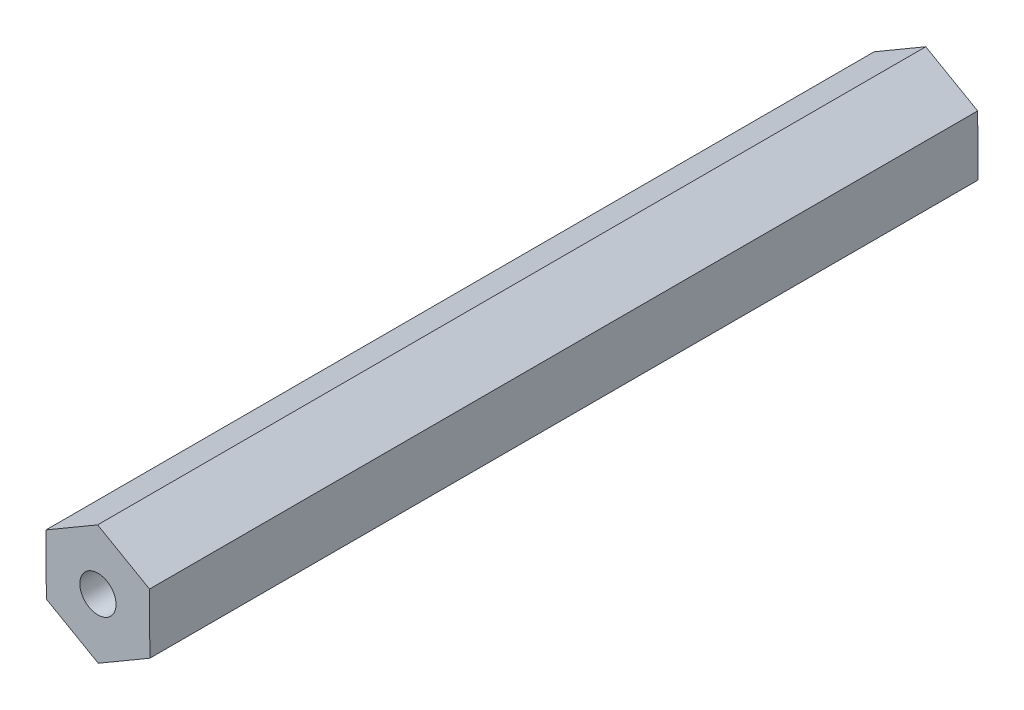
ISO-10303-21;
HEADER;
FILE_DESCRIPTION(('STEP AP214'),'2;1');
FILE_NAME('part.step','',(''),(''),'','','');
FILE_SCHEMA(('AUTOMOTIVE_DESIGN { 1 0 10303 214 1 1 1 1 }'));
ENDSEC;
DATA;
#1=APPLICATION_CONTEXT('core data for automotive mechanical design processes');
#2=APPLICATION_PROTOCOL_DEFINITION('international standard','automotive_design',2000,#1);
#3=PRODUCT_CONTEXT('',#1,'mechanical');
#4=PRODUCT('Part','Part','',(#3));
#5=PRODUCT_RELATED_PRODUCT_CATEGORY('part','',(#4));
#6=PRODUCT_DEFINITION_FORMATION('','',#4);
#7=PRODUCT_DEFINITION_CONTEXT('part definition',#1,'design');
#8=PRODUCT_DEFINITION('design','',#6,#7);
#9=PRODUCT_DEFINITION_SHAPE('','',#8);
#10=(LENGTH_UNIT() NAMED_UNIT(*) SI_UNIT(.MILLI.,.METRE.));
#11=(NAMED_UNIT(*) PLANE_ANGLE_UNIT() SI_UNIT($,.RADIAN.));
#12=(NAMED_UNIT(*) SI_UNIT($,.STERADIAN.) SOLID_ANGLE_UNIT());
#13=UNCERTAINTY_MEASURE_WITH_UNIT(LENGTH_MEASURE(1.E-05),#10,'distance_accuracy_value','');
#14=(GEOMETRIC_REPRESENTATION_CONTEXT(3) GLOBAL_UNCERTAINTY_ASSIGNED_CONTEXT((#13)) GLOBAL_UNIT_ASSIGNED_CONTEXT((#10,
#11,#12)) REPRESENTATION_CONTEXT('',''));
#15=CARTESIAN_POINT('',(0.,0.,0.));
#16=DIRECTION('',(0.,0.,1.));
#17=DIRECTION('',(1.,0.,0.));
#18=AXIS2_PLACEMENT_3D('',#15,#16,#17);
#19=CARTESIAN_POINT('',(0.0152835795497269,-2.88671088707018,40.));
#20=DIRECTION('',(-0.504578066181695,0.863366072490888,0.));
#21=DIRECTION('',(-0.863366072490888,-0.504578066181695,0.));
#22=AXIS2_PLACEMENT_3D('',#19,#20,#21);
#23=PLANE('',#22);
#24=DIRECTION('',(0.863366072490888,0.504578066181695,0.));
#25=VECTOR('',#24,1.);
#26=CARTESIAN_POINT('',(0.0152835795497269,-2.88671088707018,0.));
#27=LINE('',#26,#25);
#28=CARTESIAN_POINT('',(0.0152835795497269,-2.88671088707018,0.));
#29=VERTEX_POINT('',#28);
#30=CARTESIAN_POINT('',(2.50760675135875,-1.43011947538426,0.));
#31=VERTEX_POINT('',#30);
#32=EDGE_CURVE('E118',#29,#31,#27,.T.);
#33=ORIENTED_EDGE('',*,*,#32,.T.);
#34=DIRECTION('',(0.,0.,-1.));
#35=VECTOR('',#34,1.);
#36=CARTESIAN_POINT('',(2.50760675135875,-1.43011947538426,40.));
#37=LINE('',#36,#35);
#38=CARTESIAN_POINT('',(2.50760675135875,-1.43011947538426,40.));
#39=VERTEX_POINT('',#38);
#40=EDGE_CURVE('E11',#39,#31,#37,.T.);
#41=ORIENTED_EDGE('',*,*,#40,.F.);
#42=DIRECTION('',(0.863366072490888,0.504578066181695,0.));
#43=VECTOR('',#42,1.);
#44=CARTESIAN_POINT('',(0.0152835795497269,-2.88671088707018,40.));
#45=LINE('',#44,#43);
#46=CARTESIAN_POINT('',(0.0152835795497269,-2.88671088707018,40.));
#47=VERTEX_POINT('',#46);
#48=EDGE_CURVE('E129',#47,#39,#45,.T.);
#49=ORIENTED_EDGE('',*,*,#48,.F.);
#50=DIRECTION('',(0.,0.,-1.));
#51=VECTOR('',#50,1.);
#52=CARTESIAN_POINT('',(0.0152835795497269,-2.88671088707018,40.));
#53=LINE('',#52,#51);
#54=EDGE_CURVE('E114',#47,#29,#53,.T.);
#55=ORIENTED_EDGE('',*,*,#54,.T.);
#56=EDGE_LOOP('',(#33,#41,#49,#55));
#57=FACE_BOUND('',#56,.T.);
#58=ADVANCED_FACE('F34',(#57),#23,.F.);
#59=CARTESIAN_POINT('',(2.50760675135875,-1.43011947538426,40.));
#60=DIRECTION('',(-0.999985984633554,-0.00529438726032995,0.));
#61=DIRECTION('',(0.00529438726032995,-0.999985984633554,0.));
#62=AXIS2_PLACEMENT_3D('',#59,#60,#61);
#63=PLANE('',#62);
#64=DIRECTION('',(-0.00529438726032995,0.999985984633553,0.));
#65=VECTOR('',#64,1.);
#66=CARTESIAN_POINT('',(2.50760675135875,-1.43011947538426,0.));
#67=LINE('',#66,#65);
#68=CARTESIAN_POINT('',(2.49232317180902,1.45659141168591,0.));
#69=VERTEX_POINT('',#68);
#70=EDGE_CURVE('E121',#31,#69,#67,.T.);
#71=ORIENTED_EDGE('',*,*,#70,.T.);
#72=DIRECTION('',(0.,0.,-1.));
#73=VECTOR('',#72,1.);
#74=CARTESIAN_POINT('',(2.49232317180902,1.45659141168591,40.));
#75=LINE('',#74,#73);
#76=CARTESIAN_POINT('',(2.49232317180902,1.45659141168591,40.));
#77=VERTEX_POINT('',#76);
#78=EDGE_CURVE('E42',#77,#69,#75,.T.);
#79=ORIENTED_EDGE('',*,*,#78,.F.);
#80=DIRECTION('',(-0.00529438726032995,0.999985984633553,0.));
#81=VECTOR('',#80,1.);
#82=CARTESIAN_POINT('',(2.50760675135875,-1.43011947538426,40.));
#83=LINE('',#82,#81);
#84=EDGE_CURVE('E87',#39,#77,#83,.T.);
#85=ORIENTED_EDGE('',*,*,#84,.F.);
#86=ORIENTED_EDGE('',*,*,#40,.T.);
#87=EDGE_LOOP('',(#71,#79,#85,#86));
#88=FACE_BOUND('',#87,.T.);
#89=ADVANCED_FACE('F154',(#88),#63,.F.);
#90=CARTESIAN_POINT('',(2.49232317180902,1.45659141168591,40.));
#91=DIRECTION('',(-0.495407918451859,-0.868660459751218,0.));
#92=DIRECTION('',(0.868660459751218,-0.495407918451858,0.));
#93=AXIS2_PLACEMENT_3D('',#90,#91,#92);
#94=PLANE('',#93);
#95=DIRECTION('',(-0.868660459751218,0.495407918451858,0.));
#96=VECTOR('',#95,1.);
#97=CARTESIAN_POINT('',(2.49232317180902,1.45659141168591,0.));
#98=LINE('',#97,#96);
#99=CARTESIAN_POINT('',(-0.0152835795497264,2.88671088707018,0.));
#100=VERTEX_POINT('',#99);
#101=EDGE_CURVE('E124',#69,#100,#98,.T.);
#102=ORIENTED_EDGE('',*,*,#101,.T.);
#103=DIRECTION('',(0.,0.,-1.));
#104=VECTOR('',#103,1.);
#105=CARTESIAN_POINT('',(-0.0152835795497264,2.88671088707018,40.));
#106=LINE('',#105,#104);
#107=CARTESIAN_POINT('',(-0.0152835795497264,2.88671088707018,40.));
#108=VERTEX_POINT('',#107);
#109=EDGE_CURVE('E109',#108,#100,#106,.T.);
#110=ORIENTED_EDGE('',*,*,#109,.F.);
#111=DIRECTION('',(-0.868660459751218,0.495407918451858,0.));
#112=VECTOR('',#111,1.);
#113=CARTESIAN_POINT('',(2.49232317180902,1.45659141168591,40.));
#114=LINE('',#113,#112);
#115=EDGE_CURVE('E100',#77,#108,#114,.T.);
#116=ORIENTED_EDGE('',*,*,#115,.F.);
#117=ORIENTED_EDGE('',*,*,#78,.T.);
#118=EDGE_LOOP('',(#102,#110,#116,#117));
#119=FACE_BOUND('',#118,.T.);
#120=ADVANCED_FACE('F135',(#119),#94,.F.);
#121=CARTESIAN_POINT('',(-0.0152835795497264,2.88671088707018,40.));
#122=DIRECTION('',(0.504578066181695,-0.863366072490888,0.));
#123=DIRECTION('',(0.863366072490888,0.504578066181695,0.));
#124=AXIS2_PLACEMENT_3D('',#121,#122,#123);
#125=PLANE('',#124);
#126=DIRECTION('',(-0.863366072490888,-0.504578066181695,0.));
#127=VECTOR('',#126,1.);
#128=CARTESIAN_POINT('',(-0.0152835795497264,2.88671088707018,0.));
#129=LINE('',#128,#127);
#130=CARTESIAN_POINT('',(-2.50760675135875,1.43011947538426,0.));
#131=VERTEX_POINT('',#130);
#132=EDGE_CURVE('E108',#100,#131,#129,.T.);
#133=ORIENTED_EDGE('',*,*,#132,.T.);
#134=DIRECTION('',(0.,0.,-1.));
#135=VECTOR('',#134,1.);
#136=CARTESIAN_POINT('',(-2.50760675135875,1.43011947538426,40.));
#137=LINE('',#136,#135);
#138=CARTESIAN_POINT('',(-2.50760675135875,1.43011947538426,40.));
#139=VERTEX_POINT('',#138);
#140=EDGE_CURVE('E105',#139,#131,#137,.T.);
#141=ORIENTED_EDGE('',*,*,#140,.F.);
#142=DIRECTION('',(-0.863366072490888,-0.504578066181695,0.));
#143=VECTOR('',#142,1.);
#144=CARTESIAN_POINT('',(-0.0152835795497264,2.88671088707018,40.));
#145=LINE('',#144,#143);
#146=EDGE_CURVE('E94',#108,#139,#145,.T.);
#147=ORIENTED_EDGE('',*,*,#146,.F.);
#148=ORIENTED_EDGE('',*,*,#109,.T.);
#149=EDGE_LOOP('',(#133,#141,#147,#148));
#150=FACE_BOUND('',#149,.T.);
#151=ADVANCED_FACE('F106',(#150),#125,.F.);
#152=CARTESIAN_POINT('',(-2.50760675135875,1.43011947538426,40.));
#153=DIRECTION('',(0.999985984633554,0.00529438726032966,0.));
#154=DIRECTION('',(-0.00529438726032966,0.999985984633554,0.));
#155=AXIS2_PLACEMENT_3D('',#152,#153,#154);
#156=PLANE('',#155);
#157=DIRECTION('',(0.00529438726032966,-0.999985984633554,0.));
#158=VECTOR('',#157,1.);
#159=CARTESIAN_POINT('',(-2.50760675135875,1.43011947538426,0.));
#160=LINE('',#159,#158);
#161=CARTESIAN_POINT('',(-2.49232317180902,-1.45659141168591,0.));
#162=VERTEX_POINT('',#161);
#163=EDGE_CURVE('E73',#131,#162,#160,.T.);
#164=ORIENTED_EDGE('',*,*,#163,.T.);
#165=DIRECTION('',(0.,0.,-1.));
#166=VECTOR('',#165,1.);
#167=CARTESIAN_POINT('',(-2.49232317180902,-1.45659141168591,40.));
#168=LINE('',#167,#166);
#169=CARTESIAN_POINT('',(-2.49232317180902,-1.45659141168591,40.));
#170=VERTEX_POINT('',#169);
#171=EDGE_CURVE('E110',#170,#162,#168,.T.);
#172=ORIENTED_EDGE('',*,*,#171,.F.);
#173=DIRECTION('',(0.00529438726032966,-0.999985984633554,0.));
#174=VECTOR('',#173,1.);
#175=CARTESIAN_POINT('',(-2.50760675135875,1.43011947538426,40.));
#176=LINE('',#175,#174);
#177=EDGE_CURVE('E98',#139,#170,#176,.T.);
#178=ORIENTED_EDGE('',*,*,#177,.F.);
#179=ORIENTED_EDGE('',*,*,#140,.T.);
#180=EDGE_LOOP('',(#164,#172,#178,#179));
#181=FACE_BOUND('',#180,.T.);
#182=ADVANCED_FACE('F112',(#181),#156,.F.);
#183=CARTESIAN_POINT('',(-2.49232317180902,-1.45659141168591,40.));
#184=DIRECTION('',(0.495407918451859,0.868660459751218,0.));
#185=DIRECTION('',(-0.868660459751218,0.495407918451859,0.));
#186=AXIS2_PLACEMENT_3D('',#183,#184,#185);
#187=PLANE('',#186);
#188=DIRECTION('',(0.868660459751217,-0.495407918451859,0.));
#189=VECTOR('',#188,1.);
#190=CARTESIAN_POINT('',(-2.49232317180902,-1.45659141168591,0.));
#191=LINE('',#190,#189);
#192=EDGE_CURVE('E79',#162,#29,#191,.T.);
#193=ORIENTED_EDGE('',*,*,#192,.T.);
#194=ORIENTED_EDGE('',*,*,#54,.F.);
#195=DIRECTION('',(0.868660459751217,-0.495407918451859,0.));
#196=VECTOR('',#195,1.);
#197=CARTESIAN_POINT('',(-2.49232317180902,-1.45659141168591,40.));
#198=LINE('',#197,#196);
#199=EDGE_CURVE('E50',#170,#47,#198,.T.);
#200=ORIENTED_EDGE('',*,*,#199,.F.);
#201=ORIENTED_EDGE('',*,*,#171,.T.);
#202=EDGE_LOOP('',(#193,#194,#200,#201));
#203=FACE_BOUND('',#202,.T.);
#204=ADVANCED_FACE('F142',(#203),#187,.F.);
#205=CARTESIAN_POINT('',(2.50760675135875,-1.43011947538426,40.));
#206=DIRECTION('',(0.,0.,1.));
#207=DIRECTION('',(1.,0.,0.));
#208=AXIS2_PLACEMENT_3D('',#205,#206,#207);
#209=PLANE('',#208);
#210=CARTESIAN_POINT('',(0.,0.,40.));
#211=DIRECTION('',(0.,0.,1.));
#212=DIRECTION('',(1.,0.,0.));
#213=AXIS2_PLACEMENT_3D('',#210,#211,#212);
#214=CIRCLE('',#213,0.874999999999987);
#215=CARTESIAN_POINT('',(0.874999999999987,0.,40.));
#216=VERTEX_POINT('',#215);
#217=EDGE_CURVE('E211',#216,#216,#214,.T.);
#218=ORIENTED_EDGE('',*,*,#217,.F.);
#219=EDGE_LOOP('',(#218));
#220=FACE_BOUND('',#219,.T.);
#221=ORIENTED_EDGE('',*,*,#48,.T.);
#222=ORIENTED_EDGE('',*,*,#84,.T.);
#223=ORIENTED_EDGE('',*,*,#115,.T.);
#224=ORIENTED_EDGE('',*,*,#146,.T.);
#225=ORIENTED_EDGE('',*,*,#177,.T.);
#226=ORIENTED_EDGE('',*,*,#199,.T.);
#227=EDGE_LOOP('',(#221,#222,#223,#224,#225,#226));
#228=FACE_BOUND('',#227,.T.);
#229=ADVANCED_FACE('F96',(#220,#228),#209,.T.);
#230=CARTESIAN_POINT('',(2.50760675135875,-1.43011947538426,0.));
#231=DIRECTION('',(0.,0.,1.));
#232=DIRECTION('',(1.,0.,0.));
#233=AXIS2_PLACEMENT_3D('',#230,#231,#232);
#234=PLANE('',#233);
#235=CARTESIAN_POINT('',(0.,0.,0.));
#236=DIRECTION('',(0.,0.,1.));
#237=DIRECTION('',(1.,0.,0.));
#238=AXIS2_PLACEMENT_3D('',#235,#236,#237);
#239=CIRCLE('',#238,0.87499999999999);
#240=CARTESIAN_POINT('',(0.87499999999999,0.,0.));
#241=VERTEX_POINT('',#240);
#242=EDGE_CURVE('E122',#241,#241,#239,.T.);
#243=ORIENTED_EDGE('',*,*,#242,.T.);
#244=EDGE_LOOP('',(#243));
#245=FACE_BOUND('',#244,.T.);
#246=ORIENTED_EDGE('',*,*,#32,.F.);
#247=ORIENTED_EDGE('',*,*,#192,.F.);
#248=ORIENTED_EDGE('',*,*,#163,.F.);
#249=ORIENTED_EDGE('',*,*,#132,.F.);
#250=ORIENTED_EDGE('',*,*,#101,.F.);
#251=ORIENTED_EDGE('',*,*,#70,.F.);
#252=EDGE_LOOP('',(#246,#247,#248,#249,#250,#251));
#253=FACE_BOUND('',#252,.T.);
#254=ADVANCED_FACE('F138',(#245,#253),#234,.F.);
#255=CARTESIAN_POINT('',(0.,0.,40.));
#256=DIRECTION('',(0.,0.,1.));
#257=DIRECTION('',(1.,0.,0.));
#258=AXIS2_PLACEMENT_3D('',#255,#256,#257);
#259=CYLINDRICAL_SURFACE('',#258,0.874999999999989);
#260=ORIENTED_EDGE('',*,*,#242,.F.);
#261=EDGE_LOOP('',(#260));
#262=FACE_BOUND('',#261,.T.);
#263=ORIENTED_EDGE('',*,*,#217,.T.);
#264=EDGE_LOOP('',(#263));
#265=FACE_BOUND('',#264,.T.);
#266=ADVANCED_FACE('F191',(#262,#265),#259,.F.);
#267=CLOSED_SHELL('',(#58,#89,#120,#151,#182,#204,#229,#254,#266));
#268=MANIFOLD_SOLID_BREP('B2',#267);
#269=ADVANCED_BREP_SHAPE_REPRESENTATION('',(#18,#268),#14);
#270=SHAPE_DEFINITION_REPRESENTATION(#9,#269);
ENDSEC;
END-ISO-10303-21;
